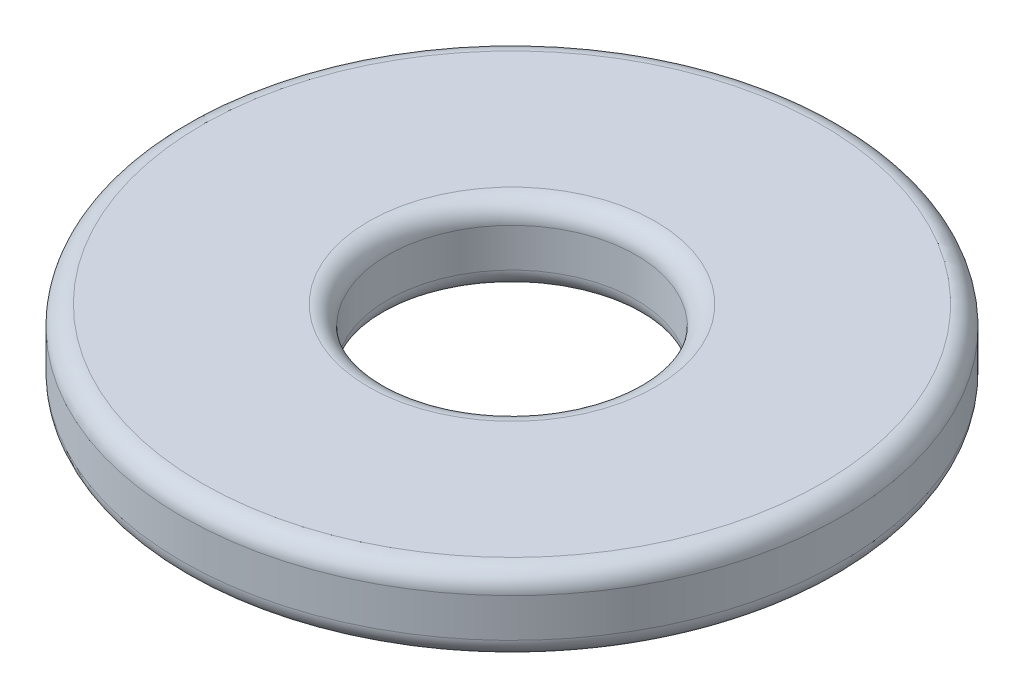
ISO-10303-21;
HEADER;
FILE_DESCRIPTION(('STEP AP214'),'2;1');
FILE_NAME('part.step','',(''),(''),'','','');
FILE_SCHEMA(('AUTOMOTIVE_DESIGN { 1 0 10303 214 1 1 1 1 }'));
ENDSEC;
DATA;
#1=APPLICATION_CONTEXT('core data for automotive mechanical design processes');
#2=APPLICATION_PROTOCOL_DEFINITION('international standard','automotive_design',2000,#1);
#3=PRODUCT_CONTEXT('',#1,'mechanical');
#4=PRODUCT('Part','Part','',(#3));
#5=PRODUCT_RELATED_PRODUCT_CATEGORY('part','',(#4));
#6=PRODUCT_DEFINITION_FORMATION('','',#4);
#7=PRODUCT_DEFINITION_CONTEXT('part definition',#1,'design');
#8=PRODUCT_DEFINITION('design','',#6,#7);
#9=PRODUCT_DEFINITION_SHAPE('','',#8);
#10=(LENGTH_UNIT() NAMED_UNIT(*) SI_UNIT(.MILLI.,.METRE.));
#11=(NAMED_UNIT(*) PLANE_ANGLE_UNIT() SI_UNIT($,.RADIAN.));
#12=(NAMED_UNIT(*) SI_UNIT($,.STERADIAN.) SOLID_ANGLE_UNIT());
#13=UNCERTAINTY_MEASURE_WITH_UNIT(LENGTH_MEASURE(1.E-05),#10,'distance_accuracy_value','');
#14=(GEOMETRIC_REPRESENTATION_CONTEXT(3) GLOBAL_UNCERTAINTY_ASSIGNED_CONTEXT((#13)) GLOBAL_UNIT_ASSIGNED_CONTEXT((#10,
#11,#12)) REPRESENTATION_CONTEXT('',''));
#15=CARTESIAN_POINT('',(0.,0.,0.));
#16=DIRECTION('',(0.,0.,1.));
#17=DIRECTION('',(1.,0.,0.));
#18=AXIS2_PLACEMENT_3D('',#15,#16,#17);
#19=CARTESIAN_POINT('',(0.,1.,0.));
#20=DIRECTION('',(0.,-1.,0.));
#21=DIRECTION('',(0.,0.,-1.));
#22=AXIS2_PLACEMENT_3D('',#19,#20,#21);
#23=CYLINDRICAL_SURFACE('',#22,1.6);
#24=CARTESIAN_POINT('',(0.,0.75,0.));
#25=DIRECTION('',(0.,1.,0.));
#26=DIRECTION('',(0.,0.,1.));
#27=AXIS2_PLACEMENT_3D('',#24,#25,#26);
#28=CIRCLE('',#27,1.6);
#29=CARTESIAN_POINT('',(0.,0.75,1.6));
#30=VERTEX_POINT('',#29);
#31=EDGE_CURVE('E52',#30,#30,#28,.T.);
#32=ORIENTED_EDGE('',*,*,#31,.T.);
#33=EDGE_LOOP('',(#32));
#34=FACE_BOUND('',#33,.T.);
#35=CARTESIAN_POINT('',(0.,0.25,0.));
#36=DIRECTION('',(0.,1.,0.));
#37=DIRECTION('',(0.,0.,1.));
#38=AXIS2_PLACEMENT_3D('',#35,#36,#37);
#39=CIRCLE('',#38,1.6);
#40=CARTESIAN_POINT('',(0.,0.25,1.6));
#41=VERTEX_POINT('',#40);
#42=EDGE_CURVE('E57',#41,#41,#39,.F.);
#43=ORIENTED_EDGE('',*,*,#42,.T.);
#44=EDGE_LOOP('',(#43));
#45=FACE_BOUND('',#44,.T.);
#46=ADVANCED_FACE('F39',(#34,#45),#23,.F.);
#47=CARTESIAN_POINT('',(0.,1.,0.));
#48=DIRECTION('',(0.,-1.,0.));
#49=DIRECTION('',(0.,0.,-1.));
#50=AXIS2_PLACEMENT_3D('',#47,#48,#49);
#51=CYLINDRICAL_SURFACE('',#50,4.25);
#52=CARTESIAN_POINT('',(0.,0.25,0.));
#53=DIRECTION('',(0.,1.,0.));
#54=DIRECTION('',(0.,0.,1.));
#55=AXIS2_PLACEMENT_3D('',#52,#53,#54);
#56=CIRCLE('',#55,4.25);
#57=CARTESIAN_POINT('',(0.,0.25,4.25));
#58=VERTEX_POINT('',#57);
#59=EDGE_CURVE('E71',#58,#58,#56,.T.);
#60=ORIENTED_EDGE('',*,*,#59,.T.);
#61=EDGE_LOOP('',(#60));
#62=FACE_BOUND('',#61,.T.);
#63=CARTESIAN_POINT('',(0.,0.75,0.));
#64=DIRECTION('',(0.,1.,0.));
#65=DIRECTION('',(0.,0.,1.));
#66=AXIS2_PLACEMENT_3D('',#63,#64,#65);
#67=CIRCLE('',#66,4.25);
#68=CARTESIAN_POINT('',(0.,0.75,4.25));
#69=VERTEX_POINT('',#68);
#70=EDGE_CURVE('E75',#69,#69,#67,.F.);
#71=ORIENTED_EDGE('',*,*,#70,.T.);
#72=EDGE_LOOP('',(#71));
#73=FACE_BOUND('',#72,.T.);
#74=ADVANCED_FACE('F80',(#62,#73),#51,.T.);
#75=CARTESIAN_POINT('',(0.,1.,0.));
#76=DIRECTION('',(0.,1.,0.));
#77=DIRECTION('',(0.,0.,1.));
#78=AXIS2_PLACEMENT_3D('',#75,#76,#77);
#79=PLANE('',#78);
#80=CARTESIAN_POINT('',(0.,1.,0.));
#81=DIRECTION('',(0.,1.,0.));
#82=DIRECTION('',(0.,0.,1.));
#83=AXIS2_PLACEMENT_3D('',#80,#81,#82);
#84=CIRCLE('',#83,1.85);
#85=CARTESIAN_POINT('',(0.,1.,1.85));
#86=VERTEX_POINT('',#85);
#87=EDGE_CURVE('E47',#86,#86,#84,.F.);
#88=ORIENTED_EDGE('',*,*,#87,.T.);
#89=EDGE_LOOP('',(#88));
#90=FACE_BOUND('',#89,.T.);
#91=CARTESIAN_POINT('',(0.,1.,0.));
#92=DIRECTION('',(0.,1.,0.));
#93=DIRECTION('',(0.,0.,1.));
#94=AXIS2_PLACEMENT_3D('',#91,#92,#93);
#95=CIRCLE('',#94,4.);
#96=CARTESIAN_POINT('',(0.,1.,4.));
#97=VERTEX_POINT('',#96);
#98=EDGE_CURVE('E63',#97,#97,#95,.T.);
#99=ORIENTED_EDGE('',*,*,#98,.T.);
#100=EDGE_LOOP('',(#99));
#101=FACE_BOUND('',#100,.T.);
#102=ADVANCED_FACE('F90',(#90,#101),#79,.T.);
#103=CARTESIAN_POINT('',(0.,0.,0.));
#104=DIRECTION('',(0.,1.,0.));
#105=DIRECTION('',(0.,0.,1.));
#106=AXIS2_PLACEMENT_3D('',#103,#104,#105);
#107=PLANE('',#106);
#108=CARTESIAN_POINT('',(0.,0.,0.));
#109=DIRECTION('',(0.,1.,0.));
#110=DIRECTION('',(0.,0.,1.));
#111=AXIS2_PLACEMENT_3D('',#108,#109,#110);
#112=CIRCLE('',#111,1.85);
#113=CARTESIAN_POINT('',(0.,0.,1.85));
#114=VERTEX_POINT('',#113);
#115=EDGE_CURVE('E10',#114,#114,#112,.T.);
#116=ORIENTED_EDGE('',*,*,#115,.T.);
#117=EDGE_LOOP('',(#116));
#118=FACE_BOUND('',#117,.T.);
#119=CARTESIAN_POINT('',(0.,0.,0.));
#120=DIRECTION('',(0.,1.,0.));
#121=DIRECTION('',(0.,0.,1.));
#122=AXIS2_PLACEMENT_3D('',#119,#120,#121);
#123=CIRCLE('',#122,4.);
#124=CARTESIAN_POINT('',(0.,0.,4.));
#125=VERTEX_POINT('',#124);
#126=EDGE_CURVE('E67',#125,#125,#123,.F.);
#127=ORIENTED_EDGE('',*,*,#126,.T.);
#128=EDGE_LOOP('',(#127));
#129=FACE_BOUND('',#128,.T.);
#130=ADVANCED_FACE('F92',(#118,#129),#107,.F.);
#131=CARTESIAN_POINT('',(0.,0.25,0.));
#132=DIRECTION('',(0.,1.,0.));
#133=DIRECTION('',(0.,0.,1.));
#134=AXIS2_PLACEMENT_3D('',#131,#132,#133);
#135=TOROIDAL_SURFACE('',#134,4.,0.25);
#136=ORIENTED_EDGE('',*,*,#126,.F.);
#137=EDGE_LOOP('',(#136));
#138=FACE_BOUND('',#137,.T.);
#139=ORIENTED_EDGE('',*,*,#59,.F.);
#140=EDGE_LOOP('',(#139));
#141=FACE_BOUND('',#140,.T.);
#142=ADVANCED_FACE('F86',(#138,#141),#135,.T.);
#143=CARTESIAN_POINT('',(0.,0.75,0.));
#144=DIRECTION('',(0.,1.,0.));
#145=DIRECTION('',(0.,0.,1.));
#146=AXIS2_PLACEMENT_3D('',#143,#144,#145);
#147=TOROIDAL_SURFACE('',#146,4.,0.25);
#148=ORIENTED_EDGE('',*,*,#70,.F.);
#149=EDGE_LOOP('',(#148));
#150=FACE_BOUND('',#149,.T.);
#151=ORIENTED_EDGE('',*,*,#98,.F.);
#152=EDGE_LOOP('',(#151));
#153=FACE_BOUND('',#152,.T.);
#154=ADVANCED_FACE('F82',(#150,#153),#147,.T.);
#155=CARTESIAN_POINT('',(0.,0.75,0.));
#156=DIRECTION('',(0.,1.,0.));
#157=DIRECTION('',(0.,0.,1.));
#158=AXIS2_PLACEMENT_3D('',#155,#156,#157);
#159=TOROIDAL_SURFACE('',#158,1.85,0.25);
#160=ORIENTED_EDGE('',*,*,#87,.F.);
#161=EDGE_LOOP('',(#160));
#162=FACE_BOUND('',#161,.T.);
#163=ORIENTED_EDGE('',*,*,#31,.F.);
#164=EDGE_LOOP('',(#163));
#165=FACE_BOUND('',#164,.T.);
#166=ADVANCED_FACE('F85',(#162,#165),#159,.T.);
#167=CARTESIAN_POINT('',(0.,0.25,0.));
#168=DIRECTION('',(0.,1.,0.));
#169=DIRECTION('',(0.,0.,1.));
#170=AXIS2_PLACEMENT_3D('',#167,#168,#169);
#171=TOROIDAL_SURFACE('',#170,1.85,0.25);
#172=ORIENTED_EDGE('',*,*,#42,.F.);
#173=EDGE_LOOP('',(#172));
#174=FACE_BOUND('',#173,.T.);
#175=ORIENTED_EDGE('',*,*,#115,.F.);
#176=EDGE_LOOP('',(#175));
#177=FACE_BOUND('',#176,.T.);
#178=ADVANCED_FACE('F41',(#174,#177),#171,.T.);
#179=CLOSED_SHELL('',(#46,#74,#102,#130,#142,#154,#166,#178));
#180=MANIFOLD_SOLID_BREP('B2',#179);
#181=ADVANCED_BREP_SHAPE_REPRESENTATION('',(#18,#180),#14);
#182=SHAPE_DEFINITION_REPRESENTATION(#9,#181);
ENDSEC;
END-ISO-10303-21;
